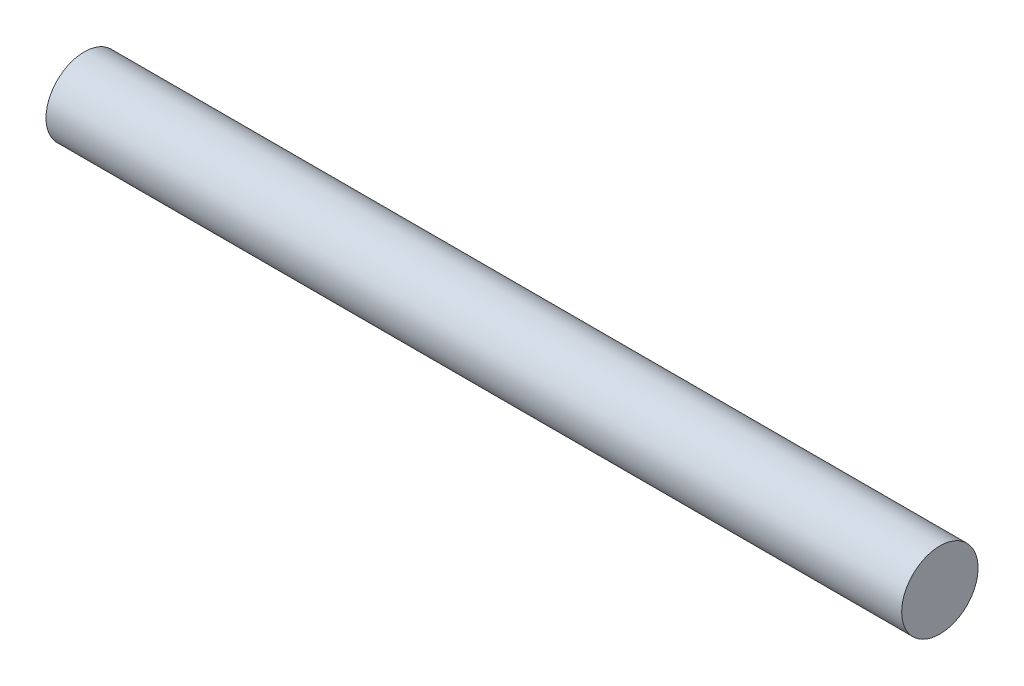
ISO-10303-21;
HEADER;
FILE_DESCRIPTION(('STEP AP214'),'2;1');
FILE_NAME('part.step','',(''),(''),'','','');
FILE_SCHEMA(('AUTOMOTIVE_DESIGN { 1 0 10303 214 1 1 1 1 }'));
ENDSEC;
DATA;
#1=APPLICATION_CONTEXT('core data for automotive mechanical design processes');
#2=APPLICATION_PROTOCOL_DEFINITION('international standard','automotive_design',2000,#1);
#3=PRODUCT_CONTEXT('',#1,'mechanical');
#4=PRODUCT('Part','Part','',(#3));
#5=PRODUCT_RELATED_PRODUCT_CATEGORY('part','',(#4));
#6=PRODUCT_DEFINITION_FORMATION('','',#4);
#7=PRODUCT_DEFINITION_CONTEXT('part definition',#1,'design');
#8=PRODUCT_DEFINITION('design','',#6,#7);
#9=PRODUCT_DEFINITION_SHAPE('','',#8);
#10=(LENGTH_UNIT() NAMED_UNIT(*) SI_UNIT(.MILLI.,.METRE.));
#11=(NAMED_UNIT(*) PLANE_ANGLE_UNIT() SI_UNIT($,.RADIAN.));
#12=(NAMED_UNIT(*) SI_UNIT($,.STERADIAN.) SOLID_ANGLE_UNIT());
#13=UNCERTAINTY_MEASURE_WITH_UNIT(LENGTH_MEASURE(1.E-05),#10,'distance_accuracy_value','');
#14=(GEOMETRIC_REPRESENTATION_CONTEXT(3) GLOBAL_UNCERTAINTY_ASSIGNED_CONTEXT((#13)) GLOBAL_UNIT_ASSIGNED_CONTEXT((#10,
#11,#12)) REPRESENTATION_CONTEXT('',''));
#15=CARTESIAN_POINT('',(0.,0.,0.));
#16=DIRECTION('',(0.,0.,1.));
#17=DIRECTION('',(1.,0.,0.));
#18=AXIS2_PLACEMENT_3D('',#15,#16,#17);
#19=CARTESIAN_POINT('',(28.,0.,0.));
#20=DIRECTION('',(1.,0.,0.));
#21=DIRECTION('',(0.,0.,-1.));
#22=AXIS2_PLACEMENT_3D('',#19,#20,#21);
#23=PLANE('',#22);
#24=CARTESIAN_POINT('',(28.,0.,0.));
#25=DIRECTION('',(-1.,0.,0.));
#26=DIRECTION('',(0.,0.,1.));
#27=AXIS2_PLACEMENT_3D('',#24,#25,#26);
#28=CIRCLE('',#27,2.5);
#29=CARTESIAN_POINT('',(28.,0.,2.5));
#30=VERTEX_POINT('',#29);
#31=EDGE_CURVE('E17',#30,#30,#28,.T.);
#32=ORIENTED_EDGE('',*,*,#31,.F.);
#33=EDGE_LOOP('',(#32));
#34=FACE_BOUND('',#33,.T.);
#35=ADVANCED_FACE('F14',(#34),#23,.T.);
#36=CARTESIAN_POINT('',(-28.,0.,0.));
#37=DIRECTION('',(1.,0.,0.));
#38=DIRECTION('',(0.,0.,-1.));
#39=AXIS2_PLACEMENT_3D('',#36,#37,#38);
#40=PLANE('',#39);
#41=CARTESIAN_POINT('',(-28.,0.,0.));
#42=DIRECTION('',(-1.,0.,0.));
#43=DIRECTION('',(0.,0.,1.));
#44=AXIS2_PLACEMENT_3D('',#41,#42,#43);
#45=CIRCLE('',#44,2.5);
#46=CARTESIAN_POINT('',(-28.,0.,2.5));
#47=VERTEX_POINT('',#46);
#48=EDGE_CURVE('E10',#47,#47,#45,.F.);
#49=ORIENTED_EDGE('',*,*,#48,.F.);
#50=EDGE_LOOP('',(#49));
#51=FACE_BOUND('',#50,.T.);
#52=ADVANCED_FACE('F29',(#51),#40,.F.);
#53=CARTESIAN_POINT('',(28.,0.,0.));
#54=DIRECTION('',(-1.,0.,0.));
#55=DIRECTION('',(0.,0.,1.));
#56=AXIS2_PLACEMENT_3D('',#53,#54,#55);
#57=CYLINDRICAL_SURFACE('',#56,2.5);
#58=ORIENTED_EDGE('',*,*,#48,.T.);
#59=EDGE_LOOP('',(#58));
#60=FACE_BOUND('',#59,.T.);
#61=ORIENTED_EDGE('',*,*,#31,.T.);
#62=EDGE_LOOP('',(#61));
#63=FACE_BOUND('',#62,.T.);
#64=ADVANCED_FACE('F26',(#60,#63),#57,.T.);
#65=CLOSED_SHELL('',(#35,#52,#64));
#66=MANIFOLD_SOLID_BREP('B1',#65);
#67=ADVANCED_BREP_SHAPE_REPRESENTATION('',(#18,#66),#14);
#68=SHAPE_DEFINITION_REPRESENTATION(#9,#67);
ENDSEC;
END-ISO-10303-21;
